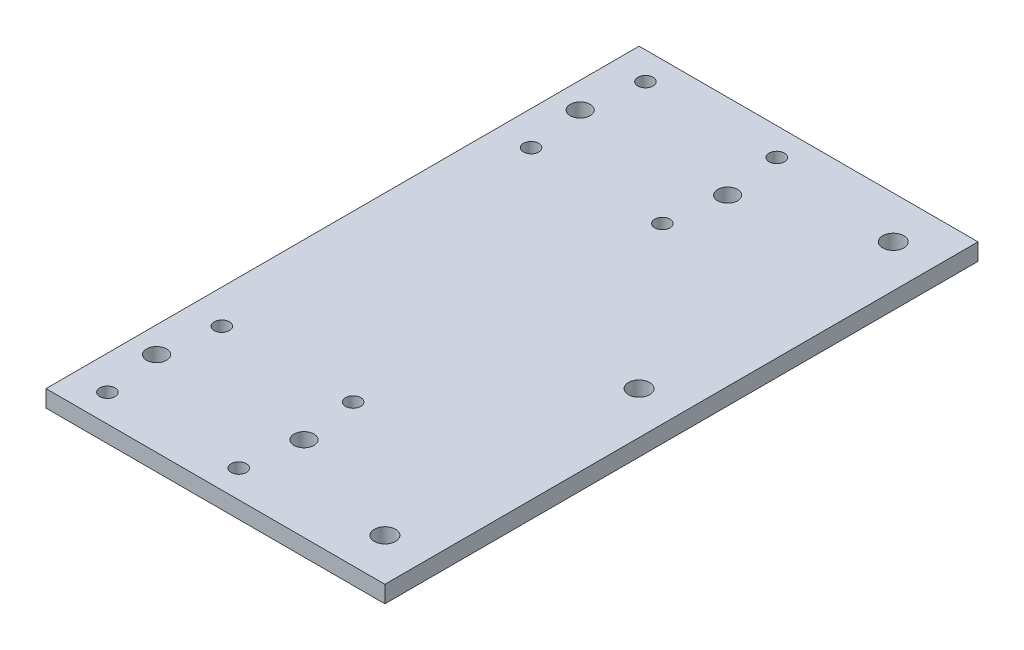
ISO-10303-21;
HEADER;
FILE_DESCRIPTION(('STEP AP214'),'2;1');
FILE_NAME('part.step','',(''),(''),'','','');
FILE_SCHEMA(('AUTOMOTIVE_DESIGN { 1 0 10303 214 1 1 1 1 }'));
ENDSEC;
DATA;
#1=APPLICATION_CONTEXT('core data for automotive mechanical design processes');
#2=APPLICATION_PROTOCOL_DEFINITION('international standard','automotive_design',2000,#1);
#3=PRODUCT_CONTEXT('',#1,'mechanical');
#4=PRODUCT('Part','Part','',(#3));
#5=PRODUCT_RELATED_PRODUCT_CATEGORY('part','',(#4));
#6=PRODUCT_DEFINITION_FORMATION('','',#4);
#7=PRODUCT_DEFINITION_CONTEXT('part definition',#1,'design');
#8=PRODUCT_DEFINITION('design','',#6,#7);
#9=PRODUCT_DEFINITION_SHAPE('','',#8);
#10=(LENGTH_UNIT() NAMED_UNIT(*) SI_UNIT(.MILLI.,.METRE.));
#11=(NAMED_UNIT(*) PLANE_ANGLE_UNIT() SI_UNIT($,.RADIAN.));
#12=(NAMED_UNIT(*) SI_UNIT($,.STERADIAN.) SOLID_ANGLE_UNIT());
#13=UNCERTAINTY_MEASURE_WITH_UNIT(LENGTH_MEASURE(1.E-05),#10,'distance_accuracy_value','');
#14=(GEOMETRIC_REPRESENTATION_CONTEXT(3) GLOBAL_UNCERTAINTY_ASSIGNED_CONTEXT((#13)) GLOBAL_UNIT_ASSIGNED_CONTEXT((#10,
#11,#12)) REPRESENTATION_CONTEXT('',''));
#15=CARTESIAN_POINT('',(0.,0.,0.));
#16=DIRECTION('',(0.,0.,1.));
#17=DIRECTION('',(1.,0.,0.));
#18=AXIS2_PLACEMENT_3D('',#15,#16,#17);
#19=CARTESIAN_POINT('',(0.,4.,0.));
#20=DIRECTION('',(0.,1.,0.));
#21=DIRECTION('',(0.,0.,1.));
#22=AXIS2_PLACEMENT_3D('',#19,#20,#21);
#23=PLANE('',#22);
#24=CARTESIAN_POINT('',(-72.,4.,36.5));
#25=DIRECTION('',(0.,1.,0.));
#26=DIRECTION('',(0.,0.,1.));
#27=AXIS2_PLACEMENT_3D('',#24,#25,#26);
#28=CIRCLE('',#27,1.79999999999999);
#29=CARTESIAN_POINT('',(-72.,4.,38.3));
#30=VERTEX_POINT('',#29);
#31=EDGE_CURVE('E210',#30,#30,#28,.T.);
#32=ORIENTED_EDGE('',*,*,#31,.F.);
#33=EDGE_LOOP('',(#32));
#34=FACE_BOUND('',#33,.T.);
#35=CARTESIAN_POINT('',(-41.,4.,-63.5));
#36=DIRECTION('',(0.,1.,0.));
#37=DIRECTION('',(0.,0.,1.));
#38=AXIS2_PLACEMENT_3D('',#35,#36,#37);
#39=CIRCLE('',#38,1.79999999999999);
#40=CARTESIAN_POINT('',(-41.,4.,-61.7));
#41=VERTEX_POINT('',#40);
#42=EDGE_CURVE('E246',#41,#41,#39,.F.);
#43=ORIENTED_EDGE('',*,*,#42,.T.);
#44=EDGE_LOOP('',(#43));
#45=FACE_BOUND('',#44,.T.);
#46=CARTESIAN_POINT('',(-72.,4.,-36.5));
#47=DIRECTION('',(0.,1.,0.));
#48=DIRECTION('',(0.,0.,1.));
#49=AXIS2_PLACEMENT_3D('',#46,#47,#48);
#50=CIRCLE('',#49,1.79999999999999);
#51=CARTESIAN_POINT('',(-72.,4.,-34.7));
#52=VERTEX_POINT('',#51);
#53=EDGE_CURVE('E276',#52,#52,#50,.F.);
#54=ORIENTED_EDGE('',*,*,#53,.T.);
#55=EDGE_LOOP('',(#54));
#56=FACE_BOUND('',#55,.T.);
#57=CARTESIAN_POINT('',(-73.9,4.,-50.));
#58=DIRECTION('',(0.,1.,0.));
#59=DIRECTION('',(0.,0.,1.));
#60=AXIS2_PLACEMENT_3D('',#57,#58,#59);
#61=CIRCLE('',#60,2.35);
#62=CARTESIAN_POINT('',(-73.9,4.,-47.65));
#63=VERTEX_POINT('',#62);
#64=EDGE_CURVE('E270',#63,#63,#61,.T.);
#65=ORIENTED_EDGE('',*,*,#64,.F.);
#66=EDGE_LOOP('',(#65));
#67=FACE_BOUND('',#66,.T.);
#68=CARTESIAN_POINT('',(-41.,4.,36.5));
#69=DIRECTION('',(0.,1.,0.));
#70=DIRECTION('',(0.,0.,1.));
#71=AXIS2_PLACEMENT_3D('',#68,#69,#70);
#72=CIRCLE('',#71,1.79999999999999);
#73=CARTESIAN_POINT('',(-41.,4.,38.3));
#74=VERTEX_POINT('',#73);
#75=EDGE_CURVE('E227',#74,#74,#72,.F.);
#76=ORIENTED_EDGE('',*,*,#75,.T.);
#77=EDGE_LOOP('',(#76));
#78=FACE_BOUND('',#77,.T.);
#79=CARTESIAN_POINT('',(-9.99999999999879,4.,60.));
#80=DIRECTION('',(0.,1.,0.));
#81=DIRECTION('',(0.,0.,1.));
#82=AXIS2_PLACEMENT_3D('',#79,#80,#81);
#83=CIRCLE('',#82,2.5);
#84=CARTESIAN_POINT('',(-9.99999999999879,4.,62.5));
#85=VERTEX_POINT('',#84);
#86=EDGE_CURVE('E233',#85,#85,#83,.T.);
#87=ORIENTED_EDGE('',*,*,#86,.F.);
#88=EDGE_LOOP('',(#87));
#89=FACE_BOUND('',#88,.T.);
#90=CARTESIAN_POINT('',(-9.99999999999941,4.,0.));
#91=DIRECTION('',(0.,1.,0.));
#92=DIRECTION('',(0.,0.,1.));
#93=AXIS2_PLACEMENT_3D('',#90,#91,#92);
#94=CIRCLE('',#93,2.5);
#95=CARTESIAN_POINT('',(-9.99999999999941,4.,2.50000000000002));
#96=VERTEX_POINT('',#95);
#97=EDGE_CURVE('E239',#96,#96,#94,.T.);
#98=ORIENTED_EDGE('',*,*,#97,.F.);
#99=EDGE_LOOP('',(#98));
#100=FACE_BOUND('',#99,.T.);
#101=CARTESIAN_POINT('',(-72.,4.,-63.5));
#102=DIRECTION('',(0.,1.,0.));
#103=DIRECTION('',(0.,0.,1.));
#104=AXIS2_PLACEMENT_3D('',#101,#102,#103);
#105=CIRCLE('',#104,1.79999999999999);
#106=CARTESIAN_POINT('',(-72.,4.,-61.7));
#107=VERTEX_POINT('',#106);
#108=EDGE_CURVE('E269',#107,#107,#105,.T.);
#109=ORIENTED_EDGE('',*,*,#108,.F.);
#110=EDGE_LOOP('',(#109));
#111=FACE_BOUND('',#110,.T.);
#112=DIRECTION('',(1.,0.,0.));
#113=VECTOR('',#112,1.);
#114=CARTESIAN_POINT('',(0.,4.,-70.));
#115=LINE('',#114,#113);
#116=CARTESIAN_POINT('',(-80.,4.,-70.));
#117=VERTEX_POINT('',#116);
#118=CARTESIAN_POINT('',(0.,4.,-70.));
#119=VERTEX_POINT('',#118);
#120=EDGE_CURVE('E102',#117,#119,#115,.T.);
#121=ORIENTED_EDGE('',*,*,#120,.F.);
#122=DIRECTION('',(0.,0.,-1.));
#123=VECTOR('',#122,1.);
#124=CARTESIAN_POINT('',(-80.,4.,0.));
#125=LINE('',#124,#123);
#126=CARTESIAN_POINT('',(-80.,4.,70.));
#127=VERTEX_POINT('',#126);
#128=EDGE_CURVE('E90',#127,#117,#125,.T.);
#129=ORIENTED_EDGE('',*,*,#128,.F.);
#130=DIRECTION('',(1.,0.,0.));
#131=VECTOR('',#130,1.);
#132=CARTESIAN_POINT('',(0.,4.,70.));
#133=LINE('',#132,#131);
#134=CARTESIAN_POINT('',(0.,4.,70.));
#135=VERTEX_POINT('',#134);
#136=EDGE_CURVE('E95',#127,#135,#133,.T.);
#137=ORIENTED_EDGE('',*,*,#136,.T.);
#138=DIRECTION('',(0.,0.,1.));
#139=VECTOR('',#138,1.);
#140=CARTESIAN_POINT('',(0.,4.,0.));
#141=LINE('',#140,#139);
#142=EDGE_CURVE('E99',#119,#135,#141,.T.);
#143=ORIENTED_EDGE('',*,*,#142,.F.);
#144=EDGE_LOOP('',(#121,#129,#137,#143));
#145=FACE_BOUND('',#144,.T.);
#146=CARTESIAN_POINT('',(-39.1,4.,50.));
#147=DIRECTION('',(0.,1.,0.));
#148=DIRECTION('',(0.,0.,1.));
#149=AXIS2_PLACEMENT_3D('',#146,#147,#148);
#150=CIRCLE('',#149,2.35);
#151=CARTESIAN_POINT('',(-39.1,4.,52.35));
#152=VERTEX_POINT('',#151);
#153=EDGE_CURVE('E221',#152,#152,#150,.T.);
#154=ORIENTED_EDGE('',*,*,#153,.F.);
#155=EDGE_LOOP('',(#154));
#156=FACE_BOUND('',#155,.T.);
#157=CARTESIAN_POINT('',(-41.,4.,63.5));
#158=DIRECTION('',(0.,1.,0.));
#159=DIRECTION('',(0.,0.,1.));
#160=AXIS2_PLACEMENT_3D('',#157,#158,#159);
#161=CIRCLE('',#160,1.79999999999999);
#162=CARTESIAN_POINT('',(-41.,4.,65.3));
#163=VERTEX_POINT('',#162);
#164=EDGE_CURVE('E213',#163,#163,#161,.T.);
#165=ORIENTED_EDGE('',*,*,#164,.F.);
#166=EDGE_LOOP('',(#165));
#167=FACE_BOUND('',#166,.T.);
#168=CARTESIAN_POINT('',(-72.,4.,63.5));
#169=DIRECTION('',(0.,1.,0.));
#170=DIRECTION('',(0.,0.,1.));
#171=AXIS2_PLACEMENT_3D('',#168,#169,#170);
#172=CIRCLE('',#171,1.79999999999999);
#173=CARTESIAN_POINT('',(-72.,4.,65.3));
#174=VERTEX_POINT('',#173);
#175=EDGE_CURVE('E206',#174,#174,#172,.F.);
#176=ORIENTED_EDGE('',*,*,#175,.T.);
#177=EDGE_LOOP('',(#176));
#178=FACE_BOUND('',#177,.T.);
#179=CARTESIAN_POINT('',(-41.,4.,-36.5));
#180=DIRECTION('',(0.,1.,0.));
#181=DIRECTION('',(0.,0.,1.));
#182=AXIS2_PLACEMENT_3D('',#179,#180,#181);
#183=CIRCLE('',#182,1.79999999999999);
#184=CARTESIAN_POINT('',(-41.,4.,-34.7));
#185=VERTEX_POINT('',#184);
#186=EDGE_CURVE('E282',#185,#185,#183,.T.);
#187=ORIENTED_EDGE('',*,*,#186,.F.);
#188=EDGE_LOOP('',(#187));
#189=FACE_BOUND('',#188,.T.);
#190=CARTESIAN_POINT('',(-39.1,4.,-50.));
#191=DIRECTION('',(0.,1.,0.));
#192=DIRECTION('',(0.,0.,1.));
#193=AXIS2_PLACEMENT_3D('',#190,#191,#192);
#194=CIRCLE('',#193,2.35);
#195=CARTESIAN_POINT('',(-39.1,4.,-47.65));
#196=VERTEX_POINT('',#195);
#197=EDGE_CURVE('E245',#196,#196,#194,.F.);
#198=ORIENTED_EDGE('',*,*,#197,.T.);
#199=EDGE_LOOP('',(#198));
#200=FACE_BOUND('',#199,.T.);
#201=CARTESIAN_POINT('',(-10.,4.,-60.));
#202=DIRECTION('',(0.,1.,0.));
#203=DIRECTION('',(0.,0.,1.));
#204=AXIS2_PLACEMENT_3D('',#201,#202,#203);
#205=CIRCLE('',#204,2.5);
#206=CARTESIAN_POINT('',(-10.,4.,-57.5));
#207=VERTEX_POINT('',#206);
#208=EDGE_CURVE('E252',#207,#207,#205,.T.);
#209=ORIENTED_EDGE('',*,*,#208,.F.);
#210=EDGE_LOOP('',(#209));
#211=FACE_BOUND('',#210,.T.);
#212=CARTESIAN_POINT('',(-73.9,4.,50.));
#213=DIRECTION('',(0.,1.,0.));
#214=DIRECTION('',(0.,0.,1.));
#215=AXIS2_PLACEMENT_3D('',#212,#213,#214);
#216=CIRCLE('',#215,2.35);
#217=CARTESIAN_POINT('',(-73.9,4.,52.35));
#218=VERTEX_POINT('',#217);
#219=EDGE_CURVE('E258',#218,#218,#216,.F.);
#220=ORIENTED_EDGE('',*,*,#219,.T.);
#221=EDGE_LOOP('',(#220));
#222=FACE_BOUND('',#221,.T.);
#223=ADVANCED_FACE('F43',(#34,#45,#56,#67,#78,#89,#100,#111,#145,#156,#167,#178,#189,#200,#211,
#222),#23,.T.);
#224=CARTESIAN_POINT('',(0.,0.,0.));
#225=DIRECTION('',(0.,1.,0.));
#226=DIRECTION('',(0.,0.,1.));
#227=AXIS2_PLACEMENT_3D('',#224,#225,#226);
#228=PLANE('',#227);
#229=CARTESIAN_POINT('',(-72.,0.,36.5));
#230=DIRECTION('',(0.,1.,0.));
#231=DIRECTION('',(0.,0.,1.));
#232=AXIS2_PLACEMENT_3D('',#229,#230,#231);
#233=CIRCLE('',#232,1.79999999999999);
#234=CARTESIAN_POINT('',(-72.,0.,38.3));
#235=VERTEX_POINT('',#234);
#236=EDGE_CURVE('E261',#235,#235,#233,.T.);
#237=ORIENTED_EDGE('',*,*,#236,.T.);
#238=EDGE_LOOP('',(#237));
#239=FACE_BOUND('',#238,.T.);
#240=CARTESIAN_POINT('',(-10.,0.,-60.));
#241=DIRECTION('',(0.,1.,0.));
#242=DIRECTION('',(0.,0.,1.));
#243=AXIS2_PLACEMENT_3D('',#240,#241,#242);
#244=CIRCLE('',#243,2.5);
#245=CARTESIAN_POINT('',(-10.,0.,-57.5));
#246=VERTEX_POINT('',#245);
#247=EDGE_CURVE('E249',#246,#246,#244,.T.);
#248=ORIENTED_EDGE('',*,*,#247,.T.);
#249=EDGE_LOOP('',(#248));
#250=FACE_BOUND('',#249,.T.);
#251=CARTESIAN_POINT('',(-41.,0.,-36.5));
#252=DIRECTION('',(0.,1.,0.));
#253=DIRECTION('',(0.,0.,1.));
#254=AXIS2_PLACEMENT_3D('',#251,#252,#253);
#255=CIRCLE('',#254,1.79999999999999);
#256=CARTESIAN_POINT('',(-41.,0.,-34.7));
#257=VERTEX_POINT('',#256);
#258=EDGE_CURVE('E279',#257,#257,#255,.T.);
#259=ORIENTED_EDGE('',*,*,#258,.T.);
#260=EDGE_LOOP('',(#259));
#261=FACE_BOUND('',#260,.T.);
#262=CARTESIAN_POINT('',(-73.9,0.,-50.));
#263=DIRECTION('',(0.,1.,0.));
#264=DIRECTION('',(0.,0.,1.));
#265=AXIS2_PLACEMENT_3D('',#262,#263,#264);
#266=CIRCLE('',#265,2.35);
#267=CARTESIAN_POINT('',(-73.9,0.,-47.65));
#268=VERTEX_POINT('',#267);
#269=EDGE_CURVE('E266',#268,#268,#266,.T.);
#270=ORIENTED_EDGE('',*,*,#269,.T.);
#271=EDGE_LOOP('',(#270));
#272=FACE_BOUND('',#271,.T.);
#273=CARTESIAN_POINT('',(-41.,0.,63.5));
#274=DIRECTION('',(0.,1.,0.));
#275=DIRECTION('',(0.,0.,1.));
#276=AXIS2_PLACEMENT_3D('',#273,#274,#275);
#277=CIRCLE('',#276,1.79999999999999);
#278=CARTESIAN_POINT('',(-41.,0.,65.3));
#279=VERTEX_POINT('',#278);
#280=EDGE_CURVE('E208',#279,#279,#277,.T.);
#281=ORIENTED_EDGE('',*,*,#280,.T.);
#282=EDGE_LOOP('',(#281));
#283=FACE_BOUND('',#282,.T.);
#284=CARTESIAN_POINT('',(-39.1,0.,50.));
#285=DIRECTION('',(0.,1.,0.));
#286=DIRECTION('',(0.,0.,1.));
#287=AXIS2_PLACEMENT_3D('',#284,#285,#286);
#288=CIRCLE('',#287,2.35);
#289=CARTESIAN_POINT('',(-39.1,0.,52.35));
#290=VERTEX_POINT('',#289);
#291=EDGE_CURVE('E218',#290,#290,#288,.T.);
#292=ORIENTED_EDGE('',*,*,#291,.T.);
#293=EDGE_LOOP('',(#292));
#294=FACE_BOUND('',#293,.T.);
#295=CARTESIAN_POINT('',(-9.99999999999879,0.,60.));
#296=DIRECTION('',(0.,1.,0.));
#297=DIRECTION('',(0.,0.,1.));
#298=AXIS2_PLACEMENT_3D('',#295,#296,#297);
#299=CIRCLE('',#298,2.5);
#300=CARTESIAN_POINT('',(-9.99999999999879,0.,62.5));
#301=VERTEX_POINT('',#300);
#302=EDGE_CURVE('E230',#301,#301,#299,.T.);
#303=ORIENTED_EDGE('',*,*,#302,.T.);
#304=EDGE_LOOP('',(#303));
#305=FACE_BOUND('',#304,.T.);
#306=CARTESIAN_POINT('',(-9.99999999999941,0.,0.));
#307=DIRECTION('',(0.,1.,0.));
#308=DIRECTION('',(0.,0.,1.));
#309=AXIS2_PLACEMENT_3D('',#306,#307,#308);
#310=CIRCLE('',#309,2.5);
#311=CARTESIAN_POINT('',(-9.99999999999941,0.,2.50000000000002));
#312=VERTEX_POINT('',#311);
#313=EDGE_CURVE('E236',#312,#312,#310,.T.);
#314=ORIENTED_EDGE('',*,*,#313,.T.);
#315=EDGE_LOOP('',(#314));
#316=FACE_BOUND('',#315,.T.);
#317=CARTESIAN_POINT('',(-72.,0.,-63.5));
#318=DIRECTION('',(0.,1.,0.));
#319=DIRECTION('',(0.,0.,1.));
#320=AXIS2_PLACEMENT_3D('',#317,#318,#319);
#321=CIRCLE('',#320,1.79999999999999);
#322=CARTESIAN_POINT('',(-72.,0.,-61.7));
#323=VERTEX_POINT('',#322);
#324=EDGE_CURVE('E111',#323,#323,#321,.T.);
#325=ORIENTED_EDGE('',*,*,#324,.T.);
#326=EDGE_LOOP('',(#325));
#327=FACE_BOUND('',#326,.T.);
#328=DIRECTION('',(1.,0.,0.));
#329=VECTOR('',#328,1.);
#330=CARTESIAN_POINT('',(0.,0.,-70.));
#331=LINE('',#330,#329);
#332=CARTESIAN_POINT('',(-80.,0.,-70.));
#333=VERTEX_POINT('',#332);
#334=CARTESIAN_POINT('',(0.,0.,-70.));
#335=VERTEX_POINT('',#334);
#336=EDGE_CURVE('E109',#333,#335,#331,.T.);
#337=ORIENTED_EDGE('',*,*,#336,.T.);
#338=DIRECTION('',(0.,0.,1.));
#339=VECTOR('',#338,1.);
#340=CARTESIAN_POINT('',(0.,0.,0.));
#341=LINE('',#340,#339);
#342=CARTESIAN_POINT('',(0.,0.,70.));
#343=VERTEX_POINT('',#342);
#344=EDGE_CURVE('E104',#335,#343,#341,.T.);
#345=ORIENTED_EDGE('',*,*,#344,.T.);
#346=DIRECTION('',(1.,0.,0.));
#347=VECTOR('',#346,1.);
#348=CARTESIAN_POINT('',(0.,0.,70.));
#349=LINE('',#348,#347);
#350=CARTESIAN_POINT('',(-80.,0.,70.));
#351=VERTEX_POINT('',#350);
#352=EDGE_CURVE('E113',#351,#343,#349,.T.);
#353=ORIENTED_EDGE('',*,*,#352,.F.);
#354=DIRECTION('',(0.,0.,-1.));
#355=VECTOR('',#354,1.);
#356=CARTESIAN_POINT('',(-80.,0.,0.));
#357=LINE('',#356,#355);
#358=EDGE_CURVE('E92',#351,#333,#357,.T.);
#359=ORIENTED_EDGE('',*,*,#358,.T.);
#360=EDGE_LOOP('',(#337,#345,#353,#359));
#361=FACE_BOUND('',#360,.T.);
#362=CARTESIAN_POINT('',(-41.,0.,36.5));
#363=DIRECTION('',(0.,1.,0.));
#364=DIRECTION('',(0.,0.,1.));
#365=AXIS2_PLACEMENT_3D('',#362,#363,#364);
#366=CIRCLE('',#365,1.79999999999999);
#367=CARTESIAN_POINT('',(-41.,0.,38.3));
#368=VERTEX_POINT('',#367);
#369=EDGE_CURVE('E224',#368,#368,#366,.F.);
#370=ORIENTED_EDGE('',*,*,#369,.F.);
#371=EDGE_LOOP('',(#370));
#372=FACE_BOUND('',#371,.T.);
#373=CARTESIAN_POINT('',(-72.,0.,63.5));
#374=DIRECTION('',(0.,1.,0.));
#375=DIRECTION('',(0.,0.,1.));
#376=AXIS2_PLACEMENT_3D('',#373,#374,#375);
#377=CIRCLE('',#376,1.79999999999999);
#378=CARTESIAN_POINT('',(-72.,0.,65.3));
#379=VERTEX_POINT('',#378);
#380=EDGE_CURVE('E203',#379,#379,#377,.F.);
#381=ORIENTED_EDGE('',*,*,#380,.F.);
#382=EDGE_LOOP('',(#381));
#383=FACE_BOUND('',#382,.T.);
#384=CARTESIAN_POINT('',(-72.,0.,-36.5));
#385=DIRECTION('',(0.,1.,0.));
#386=DIRECTION('',(0.,0.,1.));
#387=AXIS2_PLACEMENT_3D('',#384,#385,#386);
#388=CIRCLE('',#387,1.79999999999999);
#389=CARTESIAN_POINT('',(-72.,0.,-34.7));
#390=VERTEX_POINT('',#389);
#391=EDGE_CURVE('E273',#390,#390,#388,.F.);
#392=ORIENTED_EDGE('',*,*,#391,.F.);
#393=EDGE_LOOP('',(#392));
#394=FACE_BOUND('',#393,.T.);
#395=CARTESIAN_POINT('',(-39.1,0.,-50.));
#396=DIRECTION('',(0.,1.,0.));
#397=DIRECTION('',(0.,0.,1.));
#398=AXIS2_PLACEMENT_3D('',#395,#396,#397);
#399=CIRCLE('',#398,2.35);
#400=CARTESIAN_POINT('',(-39.1,0.,-47.65));
#401=VERTEX_POINT('',#400);
#402=EDGE_CURVE('E285',#401,#401,#399,.F.);
#403=ORIENTED_EDGE('',*,*,#402,.F.);
#404=EDGE_LOOP('',(#403));
#405=FACE_BOUND('',#404,.T.);
#406=CARTESIAN_POINT('',(-41.,0.,-63.5));
#407=DIRECTION('',(0.,1.,0.));
#408=DIRECTION('',(0.,0.,1.));
#409=AXIS2_PLACEMENT_3D('',#406,#407,#408);
#410=CIRCLE('',#409,1.79999999999999);
#411=CARTESIAN_POINT('',(-41.,0.,-61.7));
#412=VERTEX_POINT('',#411);
#413=EDGE_CURVE('E242',#412,#412,#410,.F.);
#414=ORIENTED_EDGE('',*,*,#413,.F.);
#415=EDGE_LOOP('',(#414));
#416=FACE_BOUND('',#415,.T.);
#417=CARTESIAN_POINT('',(-73.9,0.,50.));
#418=DIRECTION('',(0.,1.,0.));
#419=DIRECTION('',(0.,0.,1.));
#420=AXIS2_PLACEMENT_3D('',#417,#418,#419);
#421=CIRCLE('',#420,2.35);
#422=CARTESIAN_POINT('',(-73.9,0.,52.35));
#423=VERTEX_POINT('',#422);
#424=EDGE_CURVE('E255',#423,#423,#421,.F.);
#425=ORIENTED_EDGE('',*,*,#424,.F.);
#426=EDGE_LOOP('',(#425));
#427=FACE_BOUND('',#426,.T.);
#428=ADVANCED_FACE('F119',(#239,#250,#261,#272,#283,#294,#305,#316,#327,#361,#372,#383,#394,
#405,#416,#427),#228,.F.);
#429=CARTESIAN_POINT('',(0.,4.,-70.));
#430=DIRECTION('',(0.,0.,-1.));
#431=DIRECTION('',(-1.,0.,0.));
#432=AXIS2_PLACEMENT_3D('',#429,#430,#431);
#433=PLANE('',#432);
#434=ORIENTED_EDGE('',*,*,#336,.F.);
#435=DIRECTION('',(0.,-1.,0.));
#436=VECTOR('',#435,1.);
#437=CARTESIAN_POINT('',(-80.,4.,-70.));
#438=LINE('',#437,#436);
#439=EDGE_CURVE('E11',#117,#333,#438,.T.);
#440=ORIENTED_EDGE('',*,*,#439,.F.);
#441=ORIENTED_EDGE('',*,*,#120,.T.);
#442=DIRECTION('',(0.,-1.,0.));
#443=VECTOR('',#442,1.);
#444=CARTESIAN_POINT('',(0.,4.,-70.));
#445=LINE('',#444,#443);
#446=EDGE_CURVE('E60',#119,#335,#445,.T.);
#447=ORIENTED_EDGE('',*,*,#446,.T.);
#448=EDGE_LOOP('',(#434,#440,#441,#447));
#449=FACE_BOUND('',#448,.T.);
#450=ADVANCED_FACE('F45',(#449),#433,.T.);
#451=CARTESIAN_POINT('',(-80.,4.,0.));
#452=DIRECTION('',(-1.,0.,0.));
#453=DIRECTION('',(0.,0.,1.));
#454=AXIS2_PLACEMENT_3D('',#451,#452,#453);
#455=PLANE('',#454);
#456=ORIENTED_EDGE('',*,*,#358,.F.);
#457=DIRECTION('',(0.,-1.,0.));
#458=VECTOR('',#457,1.);
#459=CARTESIAN_POINT('',(-80.,4.,70.));
#460=LINE('',#459,#458);
#461=EDGE_CURVE('E52',#127,#351,#460,.T.);
#462=ORIENTED_EDGE('',*,*,#461,.F.);
#463=ORIENTED_EDGE('',*,*,#128,.T.);
#464=ORIENTED_EDGE('',*,*,#439,.T.);
#465=EDGE_LOOP('',(#456,#462,#463,#464));
#466=FACE_BOUND('',#465,.T.);
#467=ADVANCED_FACE('F88',(#466),#455,.T.);
#468=CARTESIAN_POINT('',(0.,4.,70.));
#469=DIRECTION('',(0.,0.,-1.));
#470=DIRECTION('',(-1.,0.,0.));
#471=AXIS2_PLACEMENT_3D('',#468,#469,#470);
#472=PLANE('',#471);
#473=ORIENTED_EDGE('',*,*,#352,.T.);
#474=DIRECTION('',(0.,-1.,0.));
#475=VECTOR('',#474,1.);
#476=CARTESIAN_POINT('',(0.,4.,70.));
#477=LINE('',#476,#475);
#478=EDGE_CURVE('E74',#135,#343,#477,.T.);
#479=ORIENTED_EDGE('',*,*,#478,.F.);
#480=ORIENTED_EDGE('',*,*,#136,.F.);
#481=ORIENTED_EDGE('',*,*,#461,.T.);
#482=EDGE_LOOP('',(#473,#479,#480,#481));
#483=FACE_BOUND('',#482,.T.);
#484=ADVANCED_FACE('F96',(#483),#472,.F.);
#485=CARTESIAN_POINT('',(0.,4.,0.));
#486=DIRECTION('',(1.,0.,0.));
#487=DIRECTION('',(0.,0.,-1.));
#488=AXIS2_PLACEMENT_3D('',#485,#486,#487);
#489=PLANE('',#488);
#490=ORIENTED_EDGE('',*,*,#344,.F.);
#491=ORIENTED_EDGE('',*,*,#446,.F.);
#492=ORIENTED_EDGE('',*,*,#142,.T.);
#493=ORIENTED_EDGE('',*,*,#478,.T.);
#494=EDGE_LOOP('',(#490,#491,#492,#493));
#495=FACE_BOUND('',#494,.T.);
#496=ADVANCED_FACE('F121',(#495),#489,.T.);
#497=CARTESIAN_POINT('',(-72.,0.,-63.5));
#498=DIRECTION('',(0.,1.,0.));
#499=DIRECTION('',(0.,0.,1.));
#500=AXIS2_PLACEMENT_3D('',#497,#498,#499);
#501=CYLINDRICAL_SURFACE('',#500,1.79999999999999);
#502=ORIENTED_EDGE('',*,*,#324,.F.);
#503=EDGE_LOOP('',(#502));
#504=FACE_BOUND('',#503,.T.);
#505=ORIENTED_EDGE('',*,*,#108,.T.);
#506=EDGE_LOOP('',(#505));
#507=FACE_BOUND('',#506,.T.);
#508=ADVANCED_FACE('F123',(#504,#507),#501,.F.);
#509=CARTESIAN_POINT('',(-9.99999999999941,0.,0.));
#510=DIRECTION('',(0.,1.,0.));
#511=DIRECTION('',(0.,0.,1.));
#512=AXIS2_PLACEMENT_3D('',#509,#510,#511);
#513=CYLINDRICAL_SURFACE('',#512,2.5);
#514=ORIENTED_EDGE('',*,*,#313,.F.);
#515=EDGE_LOOP('',(#514));
#516=FACE_BOUND('',#515,.T.);
#517=ORIENTED_EDGE('',*,*,#97,.T.);
#518=EDGE_LOOP('',(#517));
#519=FACE_BOUND('',#518,.T.);
#520=ADVANCED_FACE('F130',(#516,#519),#513,.F.);
#521=CARTESIAN_POINT('',(-9.99999999999879,0.,60.));
#522=DIRECTION('',(0.,1.,0.));
#523=DIRECTION('',(0.,0.,1.));
#524=AXIS2_PLACEMENT_3D('',#521,#522,#523);
#525=CYLINDRICAL_SURFACE('',#524,2.5);
#526=ORIENTED_EDGE('',*,*,#302,.F.);
#527=EDGE_LOOP('',(#526));
#528=FACE_BOUND('',#527,.T.);
#529=ORIENTED_EDGE('',*,*,#86,.T.);
#530=EDGE_LOOP('',(#529));
#531=FACE_BOUND('',#530,.T.);
#532=ADVANCED_FACE('F179',(#528,#531),#525,.F.);
#533=CARTESIAN_POINT('',(-41.,0.,36.5));
#534=DIRECTION('',(0.,1.,0.));
#535=DIRECTION('',(0.,0.,1.));
#536=AXIS2_PLACEMENT_3D('',#533,#534,#535);
#537=CYLINDRICAL_SURFACE('',#536,1.79999999999999);
#538=ORIENTED_EDGE('',*,*,#369,.T.);
#539=EDGE_LOOP('',(#538));
#540=FACE_BOUND('',#539,.T.);
#541=ORIENTED_EDGE('',*,*,#75,.F.);
#542=EDGE_LOOP('',(#541));
#543=FACE_BOUND('',#542,.T.);
#544=ADVANCED_FACE('F183',(#540,#543),#537,.F.);
#545=CARTESIAN_POINT('',(-39.1,0.,50.));
#546=DIRECTION('',(0.,1.,0.));
#547=DIRECTION('',(0.,0.,1.));
#548=AXIS2_PLACEMENT_3D('',#545,#546,#547);
#549=CYLINDRICAL_SURFACE('',#548,2.35);
#550=ORIENTED_EDGE('',*,*,#291,.F.);
#551=EDGE_LOOP('',(#550));
#552=FACE_BOUND('',#551,.T.);
#553=ORIENTED_EDGE('',*,*,#153,.T.);
#554=EDGE_LOOP('',(#553));
#555=FACE_BOUND('',#554,.T.);
#556=ADVANCED_FACE('F187',(#552,#555),#549,.F.);
#557=CARTESIAN_POINT('',(-41.,0.,63.5));
#558=DIRECTION('',(0.,1.,0.));
#559=DIRECTION('',(0.,0.,1.));
#560=AXIS2_PLACEMENT_3D('',#557,#558,#559);
#561=CYLINDRICAL_SURFACE('',#560,1.79999999999999);
#562=ORIENTED_EDGE('',*,*,#280,.F.);
#563=EDGE_LOOP('',(#562));
#564=FACE_BOUND('',#563,.T.);
#565=ORIENTED_EDGE('',*,*,#164,.T.);
#566=EDGE_LOOP('',(#565));
#567=FACE_BOUND('',#566,.T.);
#568=ADVANCED_FACE('F191',(#564,#567),#561,.F.);
#569=CARTESIAN_POINT('',(-72.,0.,63.5));
#570=DIRECTION('',(0.,1.,0.));
#571=DIRECTION('',(0.,0.,1.));
#572=AXIS2_PLACEMENT_3D('',#569,#570,#571);
#573=CYLINDRICAL_SURFACE('',#572,1.79999999999999);
#574=ORIENTED_EDGE('',*,*,#380,.T.);
#575=EDGE_LOOP('',(#574));
#576=FACE_BOUND('',#575,.T.);
#577=ORIENTED_EDGE('',*,*,#175,.F.);
#578=EDGE_LOOP('',(#577));
#579=FACE_BOUND('',#578,.T.);
#580=ADVANCED_FACE('F160',(#576,#579),#573,.F.);
#581=CARTESIAN_POINT('',(-73.9,0.,-50.));
#582=DIRECTION('',(0.,1.,0.));
#583=DIRECTION('',(0.,0.,1.));
#584=AXIS2_PLACEMENT_3D('',#581,#582,#583);
#585=CYLINDRICAL_SURFACE('',#584,2.35);
#586=ORIENTED_EDGE('',*,*,#269,.F.);
#587=EDGE_LOOP('',(#586));
#588=FACE_BOUND('',#587,.T.);
#589=ORIENTED_EDGE('',*,*,#64,.T.);
#590=EDGE_LOOP('',(#589));
#591=FACE_BOUND('',#590,.T.);
#592=ADVANCED_FACE('F156',(#588,#591),#585,.F.);
#593=CARTESIAN_POINT('',(-72.,0.,-36.5));
#594=DIRECTION('',(0.,1.,0.));
#595=DIRECTION('',(0.,0.,1.));
#596=AXIS2_PLACEMENT_3D('',#593,#594,#595);
#597=CYLINDRICAL_SURFACE('',#596,1.79999999999999);
#598=ORIENTED_EDGE('',*,*,#391,.T.);
#599=EDGE_LOOP('',(#598));
#600=FACE_BOUND('',#599,.T.);
#601=ORIENTED_EDGE('',*,*,#53,.F.);
#602=EDGE_LOOP('',(#601));
#603=FACE_BOUND('',#602,.T.);
#604=ADVANCED_FACE('F152',(#600,#603),#597,.F.);
#605=CARTESIAN_POINT('',(-41.,0.,-36.5));
#606=DIRECTION('',(0.,1.,0.));
#607=DIRECTION('',(0.,0.,1.));
#608=AXIS2_PLACEMENT_3D('',#605,#606,#607);
#609=CYLINDRICAL_SURFACE('',#608,1.79999999999999);
#610=ORIENTED_EDGE('',*,*,#258,.F.);
#611=EDGE_LOOP('',(#610));
#612=FACE_BOUND('',#611,.T.);
#613=ORIENTED_EDGE('',*,*,#186,.T.);
#614=EDGE_LOOP('',(#613));
#615=FACE_BOUND('',#614,.T.);
#616=ADVANCED_FACE('F148',(#612,#615),#609,.F.);
#617=CARTESIAN_POINT('',(-39.1,0.,-50.));
#618=DIRECTION('',(0.,1.,0.));
#619=DIRECTION('',(0.,0.,1.));
#620=AXIS2_PLACEMENT_3D('',#617,#618,#619);
#621=CYLINDRICAL_SURFACE('',#620,2.35);
#622=ORIENTED_EDGE('',*,*,#402,.T.);
#623=EDGE_LOOP('',(#622));
#624=FACE_BOUND('',#623,.T.);
#625=ORIENTED_EDGE('',*,*,#197,.F.);
#626=EDGE_LOOP('',(#625));
#627=FACE_BOUND('',#626,.T.);
#628=ADVANCED_FACE('F144',(#624,#627),#621,.F.);
#629=CARTESIAN_POINT('',(-41.,0.,-63.5));
#630=DIRECTION('',(0.,1.,0.));
#631=DIRECTION('',(0.,0.,1.));
#632=AXIS2_PLACEMENT_3D('',#629,#630,#631);
#633=CYLINDRICAL_SURFACE('',#632,1.79999999999999);
#634=ORIENTED_EDGE('',*,*,#413,.T.);
#635=EDGE_LOOP('',(#634));
#636=FACE_BOUND('',#635,.T.);
#637=ORIENTED_EDGE('',*,*,#42,.F.);
#638=EDGE_LOOP('',(#637));
#639=FACE_BOUND('',#638,.T.);
#640=ADVANCED_FACE('F147',(#636,#639),#633,.F.);
#641=CARTESIAN_POINT('',(-10.,0.,-60.));
#642=DIRECTION('',(0.,1.,0.));
#643=DIRECTION('',(0.,0.,1.));
#644=AXIS2_PLACEMENT_3D('',#641,#642,#643);
#645=CYLINDRICAL_SURFACE('',#644,2.5);
#646=ORIENTED_EDGE('',*,*,#247,.F.);
#647=EDGE_LOOP('',(#646));
#648=FACE_BOUND('',#647,.T.);
#649=ORIENTED_EDGE('',*,*,#208,.T.);
#650=EDGE_LOOP('',(#649));
#651=FACE_BOUND('',#650,.T.);
#652=ADVANCED_FACE('F169',(#648,#651),#645,.F.);
#653=CARTESIAN_POINT('',(-73.9,0.,50.));
#654=DIRECTION('',(0.,1.,0.));
#655=DIRECTION('',(0.,0.,1.));
#656=AXIS2_PLACEMENT_3D('',#653,#654,#655);
#657=CYLINDRICAL_SURFACE('',#656,2.35);
#658=ORIENTED_EDGE('',*,*,#424,.T.);
#659=EDGE_LOOP('',(#658));
#660=FACE_BOUND('',#659,.T.);
#661=ORIENTED_EDGE('',*,*,#219,.F.);
#662=EDGE_LOOP('',(#661));
#663=FACE_BOUND('',#662,.T.);
#664=ADVANCED_FACE('F165',(#660,#663),#657,.F.);
#665=CARTESIAN_POINT('',(-72.,0.,36.5));
#666=DIRECTION('',(0.,1.,0.));
#667=DIRECTION('',(0.,0.,1.));
#668=AXIS2_PLACEMENT_3D('',#665,#666,#667);
#669=CYLINDRICAL_SURFACE('',#668,1.79999999999999);
#670=ORIENTED_EDGE('',*,*,#236,.F.);
#671=EDGE_LOOP('',(#670));
#672=FACE_BOUND('',#671,.T.);
#673=ORIENTED_EDGE('',*,*,#31,.T.);
#674=EDGE_LOOP('',(#673));
#675=FACE_BOUND('',#674,.T.);
#676=ADVANCED_FACE('F162',(#672,#675),#669,.F.);
#677=CLOSED_SHELL('',(#223,#428,#450,#467,#484,#496,#508,#520,#532,#544,#556,#568,#580,#592,
#604,#616,#628,#640,#652,#664,#676));
#678=MANIFOLD_SOLID_BREP('B2',#677);
#679=ADVANCED_BREP_SHAPE_REPRESENTATION('',(#18,#678),#14);
#680=SHAPE_DEFINITION_REPRESENTATION(#9,#679);
ENDSEC;
END-ISO-10303-21;
